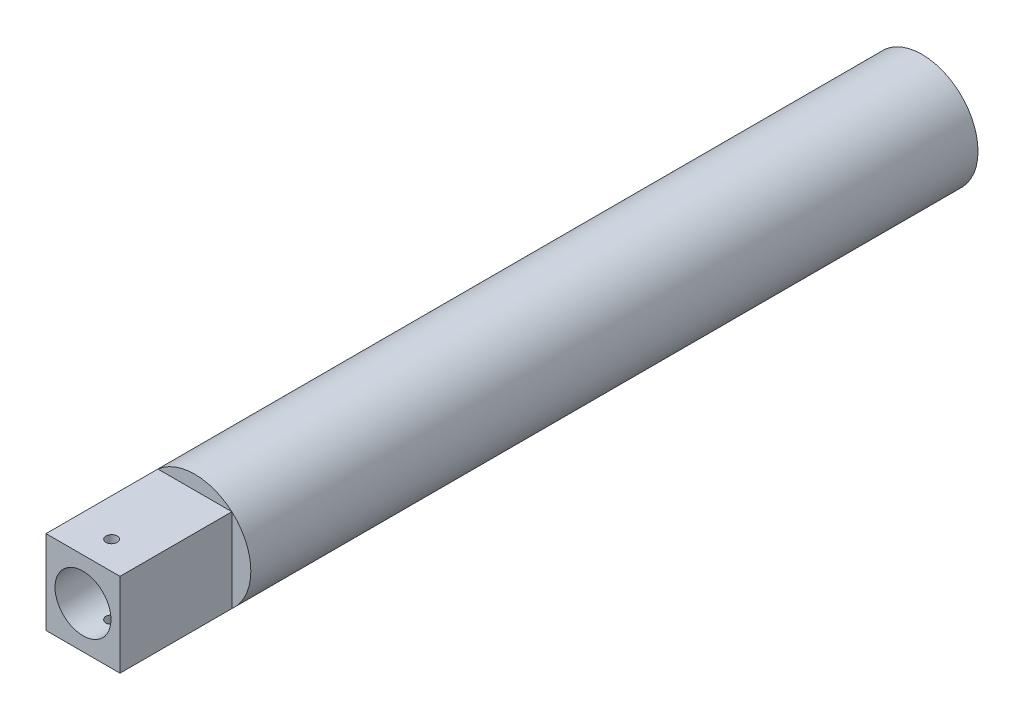
ISO-10303-21;
HEADER;
FILE_DESCRIPTION(('STEP AP214'),'2;1');
FILE_NAME('part.step','',(''),(''),'','','');
FILE_SCHEMA(('AUTOMOTIVE_DESIGN { 1 0 10303 214 1 1 1 1 }'));
ENDSEC;
DATA;
#1=APPLICATION_CONTEXT('core data for automotive mechanical design processes');
#2=APPLICATION_PROTOCOL_DEFINITION('international standard','automotive_design',2000,#1);
#3=PRODUCT_CONTEXT('',#1,'mechanical');
#4=PRODUCT('Part','Part','',(#3));
#5=PRODUCT_RELATED_PRODUCT_CATEGORY('part','',(#4));
#6=PRODUCT_DEFINITION_FORMATION('','',#4);
#7=PRODUCT_DEFINITION_CONTEXT('part definition',#1,'design');
#8=PRODUCT_DEFINITION('design','',#6,#7);
#9=PRODUCT_DEFINITION_SHAPE('','',#8);
#10=(LENGTH_UNIT() NAMED_UNIT(*) SI_UNIT(.MILLI.,.METRE.));
#11=(NAMED_UNIT(*) PLANE_ANGLE_UNIT() SI_UNIT($,.RADIAN.));
#12=(NAMED_UNIT(*) SI_UNIT($,.STERADIAN.) SOLID_ANGLE_UNIT());
#13=UNCERTAINTY_MEASURE_WITH_UNIT(LENGTH_MEASURE(1.E-05),#10,'distance_accuracy_value','');
#14=(GEOMETRIC_REPRESENTATION_CONTEXT(3) GLOBAL_UNCERTAINTY_ASSIGNED_CONTEXT((#13)) GLOBAL_UNIT_ASSIGNED_CONTEXT((#10,
#11,#12)) REPRESENTATION_CONTEXT('',''));
#15=CARTESIAN_POINT('',(0.,0.,0.));
#16=DIRECTION('',(0.,0.,1.));
#17=DIRECTION('',(1.,0.,0.));
#18=AXIS2_PLACEMENT_3D('',#15,#16,#17);
#19=CARTESIAN_POINT('',(0.114378277661477,-10.,145.));
#20=DIRECTION('',(0.,1.,0.));
#21=DIRECTION('',(0.,0.,1.));
#22=AXIS2_PLACEMENT_3D('',#19,#20,#21);
#23=CYLINDRICAL_SURFACE('',#22,1.);
#24=CARTESIAN_POINT('',(0.114378277661477,-4.99869158976619,146.));
#25=CARTESIAN_POINT('',(0.170120035537763,-4.99741506167197,145.999997895832));
#26=CARTESIAN_POINT('',(0.225867136771153,-4.99519802355829,145.995323412695));
#27=CARTESIAN_POINT('',(0.335741673011259,-4.98901929967575,145.976784440319));
#28=CARTESIAN_POINT('',(0.38986769761667,-4.98505613925301,145.962912178263));
#29=CARTESIAN_POINT('',(0.494897923069285,-4.97572645035253,145.926440121062));
#30=CARTESIAN_POINT('',(0.545805540123908,-4.97036144203048,145.903849767187));
#31=CARTESIAN_POINT('',(0.643089742596771,-4.95871343966632,145.850611296516));
#32=CARTESIAN_POINT('',(0.689466613576601,-4.95243050354126,145.819963687999));
#33=CARTESIAN_POINT('',(0.777089607106046,-4.93944562258576,145.750976338087));
#34=CARTESIAN_POINT('',(0.818256094637456,-4.93273909200816,145.712536283201));
#35=CARTESIAN_POINT('',(0.893592239114313,-4.91965022654363,145.629268015791));
#36=CARTESIAN_POINT('',(0.927761370045018,-4.91326791605652,145.584439323441));
#37=CARTESIAN_POINT('',(0.988364092906003,-4.90143856510257,145.489239552962));
#38=CARTESIAN_POINT('',(1.01473925255389,-4.89599870995302,145.438830320082));
#39=CARTESIAN_POINT('',(1.05860534738507,-4.88670245967501,145.334147652405));
#40=CARTESIAN_POINT('',(1.0760974626947,-4.88284585422241,145.279874731999));
#41=CARTESIAN_POINT('',(1.10139878851154,-4.87720076818045,145.170030388611));
#42=CARTESIAN_POINT('',(1.10937453546561,-4.87537675593952,145.114499176074));
#43=CARTESIAN_POINT('',(1.11593580594078,-4.8738793129392,145.002859161806));
#44=CARTESIAN_POINT('',(1.11452248272727,-4.87420561805494,144.946750431857));
#45=CARTESIAN_POINT('',(1.10246785144727,-4.87694579798378,144.836622151978));
#46=CARTESIAN_POINT('',(1.09199423835366,-4.87932173440697,144.782583168414));
#47=CARTESIAN_POINT('',(1.06238003976813,-4.88585473482707,144.677049932435));
#48=CARTESIAN_POINT('',(1.04323899282722,-4.89001189365457,144.62555581567));
#49=CARTESIAN_POINT('',(0.996673049075955,-4.89971531660359,144.526083404142));
#50=CARTESIAN_POINT('',(0.969181027382367,-4.9052727721345,144.478137666804));
#51=CARTESIAN_POINT('',(0.906748295938358,-4.91719581649291,144.387480619392));
#52=CARTESIAN_POINT('',(0.871806568474253,-4.9235615156875,144.344770025755));
#53=CARTESIAN_POINT('',(0.794542037788739,-4.9366252433629,144.264787383069));
#54=CARTESIAN_POINT('',(0.75207110128111,-4.94332752461851,144.227659004772));
#55=CARTESIAN_POINT('',(0.661451351880416,-4.95626611728922,144.16102793833));
#56=CARTESIAN_POINT('',(0.613302321356668,-4.96250241082891,144.131525542613));
#57=CARTESIAN_POINT('',(0.512371442416173,-4.97393853191512,144.080867231485));
#58=CARTESIAN_POINT('',(0.459567629002092,-4.97913301999783,144.059753795681));
#59=CARTESIAN_POINT('',(0.351028242511286,-4.98795955178011,144.026751231663));
#60=CARTESIAN_POINT('',(0.295293030462895,-4.99159178738191,144.01486097036));
#61=CARTESIAN_POINT('',(0.183499925002549,-4.99693954922506,144.000829890979));
#62=CARTESIAN_POINT('',(0.127464264955468,-4.99868712355804,143.998524090719));
#63=CARTESIAN_POINT('',(0.015770234793442,-5.00028701773098,144.003305251381));
#64=CARTESIAN_POINT('',(-0.0398881646351291,-5.00013948655194,144.010391473924));
#65=CARTESIAN_POINT('',(-0.148507017893883,-4.99808573969337,144.033596021351));
#66=CARTESIAN_POINT('',(-0.201492820801994,-4.99620196879863,144.049598047657));
#67=CARTESIAN_POINT('',(-0.304045995048695,-4.99101138160705,144.090076629202));
#68=CARTESIAN_POINT('',(-0.353613180239836,-4.98770448789048,144.114553645478));
#69=CARTESIAN_POINT('',(-0.448404990918725,-4.98008198030385,144.171531625564));
#70=CARTESIAN_POINT('',(-0.493587848987173,-4.97575779787315,144.204100888494));
#71=CARTESIAN_POINT('',(-0.577911134515753,-4.96667097632632,144.276249305179));
#72=CARTESIAN_POINT('',(-0.617050962267156,-4.96190829376833,144.315829153826));
#73=CARTESIAN_POINT('',(-0.688774748756434,-4.95246609881603,144.401572726019));
#74=CARTESIAN_POINT('',(-0.721252352198396,-4.94778888253687,144.447825750571));
#75=CARTESIAN_POINT('',(-0.777990126742658,-4.93918598301214,144.545188977642));
#76=CARTESIAN_POINT('',(-0.802250460262771,-4.93526028491315,144.596299084133));
#77=CARTESIAN_POINT('',(-0.841797793259557,-4.92866922267357,144.701844689803));
#78=CARTESIAN_POINT('',(-0.857102531995124,-4.92600136904368,144.756273377636));
#79=CARTESIAN_POINT('',(-0.878336186121026,-4.92226002392009,144.86698144596));
#80=CARTESIAN_POINT('',(-0.884266065339699,-4.92118636852773,144.923260635592));
#81=CARTESIAN_POINT('',(-0.886546324478016,-4.92077601157798,145.035210164376));
#82=CARTESIAN_POINT('',(-0.883032599858807,-4.92141466915198,145.090877688655));
#83=CARTESIAN_POINT('',(-0.86682528373247,-4.92429492408469,145.200815475684));
#84=CARTESIAN_POINT('',(-0.854131728784013,-4.92653651505972,145.255085743996));
#85=CARTESIAN_POINT('',(-0.819986088620032,-4.93233408682321,145.360600159378));
#86=CARTESIAN_POINT('',(-0.798551195447944,-4.9358874863174,145.411850021672));
#87=CARTESIAN_POINT('',(-0.747543871715365,-4.94386909199051,145.510051121745));
#88=CARTESIAN_POINT('',(-0.717970882550595,-4.94829735821498,145.557002064147));
#89=CARTESIAN_POINT('',(-0.651045096990274,-4.95754916646249,145.64596239723));
#90=CARTESIAN_POINT('',(-0.613591603889932,-4.96237727940446,145.687895576599));
#91=CARTESIAN_POINT('',(-0.532170930680058,-4.97176728431953,145.764928318971));
#92=CARTESIAN_POINT('',(-0.488202414182487,-4.97632912140482,145.800026476518));
#93=CARTESIAN_POINT('',(-0.394648798712733,-4.98462333309659,145.862600454121));
#94=CARTESIAN_POINT('',(-0.345028949181574,-4.98835010575967,145.890025085204));
#95=CARTESIAN_POINT('',(-0.241829078423585,-4.99441492583313,145.936110961399));
#96=CARTESIAN_POINT('',(-0.188252750935767,-4.99675425057551,145.954780263641));
#97=CARTESIAN_POINT('',(-0.0930463927034063,-4.99929853489828,145.979143034659));
#98=CARTESIAN_POINT('',(-0.0519552765109954,-4.99990161740638,145.986952875338));
#99=CARTESIAN_POINT('',(0.0308823307500083,-5.00007617911906,145.997382081365));
#100=CARTESIAN_POINT('',(0.0726288054707008,-4.99964768401582,146.00000157598));
#101=CARTESIAN_POINT('',(0.114378277661477,-4.99869158976619,146.));
#102=B_SPLINE_CURVE_WITH_KNOTS('',3,(#24,#25,#26,#27,#28,#29,#30,#31,#32,#33,#34,#35,#36,#37,
#38,#39,#40,#41,#42,#43,#44,#45,#46,#47,#48,#49,#50,#51,#52,#53,#54,#55,#56,#57,#58,#59,#60,#61,
#62,#63,#64,#65,#66,#67,#68,#69,#70,#71,#72,#73,#74,#75,#76,#77,#78,#79,#80,#81,#82,#83,#84,#85,
#86,#87,#88,#89,#90,#91,#92,#93,#94,#95,#96,#97,#98,#99,#100,#101),.UNSPECIFIED.,.T.,.F.,(4,2,2,
2,2,2,2,2,2,2,2,2,2,2,2,2,2,2,2,2,2,2,2,2,2,2,2,2,2,2,2,2,2,2,2,2,2,2,4),(0.,0.167115602610484,
0.33437261081792,0.501448993827079,0.668514839626893,0.837886159661586,1.00727020723591,
1.17789367860728,1.34849447644953,1.51606379668539,1.68361253465687,1.84812493117296,
2.01264608726031,2.17852631675926,2.34442922190201,2.514057756341,2.68369279443763,
2.85417619707057,3.02463865206955,3.19215438013514,3.35965693927154,3.52502407130943,
3.69040020067,3.85722257866074,4.02406150143365,4.19338596582118,4.3627070832438,
4.53169166369946,4.7006588697378,4.86720766800868,5.03375580300264,5.19997794684946,
5.36621150314106,5.534714444289,5.70325199741542,5.87288840069966,6.04236838751088,
6.16753778006465,6.29270405521722),.UNSPECIFIED.);
#103=CARTESIAN_POINT('',(0.114378277661477,-4.99869158976619,146.));
#104=VERTEX_POINT('',#103);
#105=EDGE_CURVE('E43',#104,#104,#102,.T.);
#106=ORIENTED_EDGE('',*,*,#105,.T.);
#107=EDGE_LOOP('',(#106));
#108=FACE_BOUND('',#107,.T.);
#109=CARTESIAN_POINT('',(0.114378277661477,-7.5,145.));
#110=DIRECTION('',(0.,-1.,0.));
#111=DIRECTION('',(0.,0.,-1.));
#112=AXIS2_PLACEMENT_3D('',#109,#110,#111);
#113=CIRCLE('',#112,1.);
#114=CARTESIAN_POINT('',(0.114378277661477,-7.5,144.));
#115=VERTEX_POINT('',#114);
#116=EDGE_CURVE('E180',#115,#115,#113,.T.);
#117=ORIENTED_EDGE('',*,*,#116,.T.);
#118=EDGE_LOOP('',(#117));
#119=FACE_BOUND('',#118,.T.);
#120=ADVANCED_FACE('F39',(#108,#119),#23,.F.);
#121=CARTESIAN_POINT('',(0.,0.,150.));
#122=DIRECTION('',(0.,0.,-1.));
#123=DIRECTION('',(-1.,0.,0.));
#124=AXIS2_PLACEMENT_3D('',#121,#122,#123);
#125=CYLINDRICAL_SURFACE('',#124,10.);
#126=CARTESIAN_POINT('',(0.,0.,0.));
#127=DIRECTION('',(0.,0.,1.));
#128=DIRECTION('',(1.,0.,0.));
#129=AXIS2_PLACEMENT_3D('',#126,#127,#128);
#130=CIRCLE('',#129,10.);
#131=CARTESIAN_POINT('',(10.,0.,0.));
#132=VERTEX_POINT('',#131);
#133=EDGE_CURVE('E11',#132,#132,#130,.T.);
#134=ORIENTED_EDGE('',*,*,#133,.T.);
#135=EDGE_LOOP('',(#134));
#136=FACE_BOUND('',#135,.T.);
#137=CARTESIAN_POINT('',(0.,0.,130.));
#138=DIRECTION('',(0.,0.,1.));
#139=DIRECTION('',(1.,0.,0.));
#140=AXIS2_PLACEMENT_3D('',#137,#138,#139);
#141=CIRCLE('',#140,10.);
#142=CARTESIAN_POINT('',(-6.61437827766148,7.5,130.));
#143=VERTEX_POINT('',#142);
#144=CARTESIAN_POINT('',(-6.61437827766148,-7.5,130.));
#145=VERTEX_POINT('',#144);
#146=EDGE_CURVE('E98',#143,#145,#141,.T.);
#147=ORIENTED_EDGE('',*,*,#146,.F.);
#148=CARTESIAN_POINT('',(0.,0.,130.));
#149=DIRECTION('',(0.,0.,1.));
#150=DIRECTION('',(1.,0.,0.));
#151=AXIS2_PLACEMENT_3D('',#148,#149,#150);
#152=CIRCLE('',#151,10.);
#153=CARTESIAN_POINT('',(6.61437827766148,7.5,130.));
#154=VERTEX_POINT('',#153);
#155=EDGE_CURVE('E106',#154,#143,#152,.T.);
#156=ORIENTED_EDGE('',*,*,#155,.F.);
#157=CARTESIAN_POINT('',(0.,0.,130.));
#158=DIRECTION('',(0.,0.,1.));
#159=DIRECTION('',(1.,0.,0.));
#160=AXIS2_PLACEMENT_3D('',#157,#158,#159);
#161=CIRCLE('',#160,10.);
#162=CARTESIAN_POINT('',(6.61437827766148,-7.5,130.));
#163=VERTEX_POINT('',#162);
#164=EDGE_CURVE('E190',#163,#154,#161,.T.);
#165=ORIENTED_EDGE('',*,*,#164,.F.);
#166=CARTESIAN_POINT('',(0.,0.,130.));
#167=DIRECTION('',(0.,0.,1.));
#168=DIRECTION('',(1.,0.,0.));
#169=AXIS2_PLACEMENT_3D('',#166,#167,#168);
#170=CIRCLE('',#169,10.);
#171=EDGE_CURVE('E108',#145,#163,#170,.T.);
#172=ORIENTED_EDGE('',*,*,#171,.F.);
#173=EDGE_LOOP('',(#147,#156,#165,#172));
#174=FACE_BOUND('',#173,.T.);
#175=ADVANCED_FACE('F41',(#136,#174),#125,.T.);
#176=CARTESIAN_POINT('',(0.,0.,150.));
#177=DIRECTION('',(0.,0.,1.));
#178=DIRECTION('',(1.,0.,0.));
#179=AXIS2_PLACEMENT_3D('',#176,#177,#178);
#180=PLANE('',#179);
#181=CARTESIAN_POINT('',(0.,0.,150.));
#182=DIRECTION('',(0.,0.,-1.));
#183=DIRECTION('',(-1.,0.,0.));
#184=AXIS2_PLACEMENT_3D('',#181,#182,#183);
#185=CIRCLE('',#184,5.);
#186=CARTESIAN_POINT('',(-5.,0.,150.));
#187=VERTEX_POINT('',#186);
#188=EDGE_CURVE('E137',#187,#187,#185,.T.);
#189=ORIENTED_EDGE('',*,*,#188,.T.);
#190=EDGE_LOOP('',(#189));
#191=FACE_BOUND('',#190,.T.);
#192=DIRECTION('',(1.,0.,0.));
#193=VECTOR('',#192,1.);
#194=CARTESIAN_POINT('',(0.,7.5,150.));
#195=LINE('',#194,#193);
#196=CARTESIAN_POINT('',(-6.61437827766148,7.5,150.));
#197=VERTEX_POINT('',#196);
#198=CARTESIAN_POINT('',(6.61437827766148,7.5,150.));
#199=VERTEX_POINT('',#198);
#200=EDGE_CURVE('E114',#197,#199,#195,.T.);
#201=ORIENTED_EDGE('',*,*,#200,.F.);
#202=DIRECTION('',(0.,-1.,0.));
#203=VECTOR('',#202,1.);
#204=CARTESIAN_POINT('',(-6.61437827766148,0.,150.));
#205=LINE('',#204,#203);
#206=CARTESIAN_POINT('',(-6.61437827766148,-7.5,150.));
#207=VERTEX_POINT('',#206);
#208=EDGE_CURVE('E61',#197,#207,#205,.T.);
#209=ORIENTED_EDGE('',*,*,#208,.T.);
#210=DIRECTION('',(1.,0.,0.));
#211=VECTOR('',#210,1.);
#212=CARTESIAN_POINT('',(0.,-7.5,150.));
#213=LINE('',#212,#211);
#214=CARTESIAN_POINT('',(6.61437827766148,-7.5,150.));
#215=VERTEX_POINT('',#214);
#216=EDGE_CURVE('E127',#207,#215,#213,.T.);
#217=ORIENTED_EDGE('',*,*,#216,.T.);
#218=DIRECTION('',(0.,-1.,0.));
#219=VECTOR('',#218,1.);
#220=CARTESIAN_POINT('',(6.61437827766148,0.,150.));
#221=LINE('',#220,#219);
#222=EDGE_CURVE('E109',#199,#215,#221,.T.);
#223=ORIENTED_EDGE('',*,*,#222,.F.);
#224=EDGE_LOOP('',(#201,#209,#217,#223));
#225=FACE_BOUND('',#224,.T.);
#226=ADVANCED_FACE('F173',(#191,#225),#180,.T.);
#227=CARTESIAN_POINT('',(0.,0.,0.));
#228=DIRECTION('',(0.,0.,1.));
#229=DIRECTION('',(1.,0.,0.));
#230=AXIS2_PLACEMENT_3D('',#227,#228,#229);
#231=PLANE('',#230);
#232=CARTESIAN_POINT('',(0.,0.,0.));
#233=DIRECTION('',(0.,0.,-1.));
#234=DIRECTION('',(-1.,0.,0.));
#235=AXIS2_PLACEMENT_3D('',#232,#233,#234);
#236=CIRCLE('',#235,5.);
#237=CARTESIAN_POINT('',(-5.,0.,0.));
#238=VERTEX_POINT('',#237);
#239=EDGE_CURVE('E232',#238,#238,#236,.T.);
#240=ORIENTED_EDGE('',*,*,#239,.F.);
#241=EDGE_LOOP('',(#240));
#242=FACE_BOUND('',#241,.T.);
#243=CARTESIAN_POINT('',(-7.5,0.,0.));
#244=DIRECTION('',(0.,0.,-1.));
#245=DIRECTION('',(-1.,0.,0.));
#246=AXIS2_PLACEMENT_3D('',#243,#244,#245);
#247=CIRCLE('',#246,1.);
#248=CARTESIAN_POINT('',(-8.5,0.,0.));
#249=VERTEX_POINT('',#248);
#250=EDGE_CURVE('E236',#249,#249,#247,.T.);
#251=ORIENTED_EDGE('',*,*,#250,.F.);
#252=EDGE_LOOP('',(#251));
#253=FACE_BOUND('',#252,.T.);
#254=CARTESIAN_POINT('',(7.5,0.,0.));
#255=DIRECTION('',(0.,0.,-1.));
#256=DIRECTION('',(-1.,0.,0.));
#257=AXIS2_PLACEMENT_3D('',#254,#255,#256);
#258=CIRCLE('',#257,0.999999999999999);
#259=CARTESIAN_POINT('',(6.5,0.,0.));
#260=VERTEX_POINT('',#259);
#261=EDGE_CURVE('E240',#260,#260,#258,.T.);
#262=ORIENTED_EDGE('',*,*,#261,.F.);
#263=EDGE_LOOP('',(#262));
#264=FACE_BOUND('',#263,.T.);
#265=ORIENTED_EDGE('',*,*,#133,.F.);
#266=EDGE_LOOP('',(#265));
#267=FACE_BOUND('',#266,.T.);
#268=ADVANCED_FACE('F222',(#242,#253,#264,#267),#231,.F.);
#269=CARTESIAN_POINT('',(0.,-7.5,130.));
#270=DIRECTION('',(0.,-1.,0.));
#271=DIRECTION('',(0.,0.,-1.));
#272=AXIS2_PLACEMENT_3D('',#269,#270,#271);
#273=PLANE('',#272);
#274=ORIENTED_EDGE('',*,*,#116,.F.);
#275=EDGE_LOOP('',(#274));
#276=FACE_BOUND('',#275,.T.);
#277=ORIENTED_EDGE('',*,*,#216,.F.);
#278=DIRECTION('',(0.,0.,1.));
#279=VECTOR('',#278,1.);
#280=CARTESIAN_POINT('',(-6.61437827766148,-7.5,130.));
#281=LINE('',#280,#279);
#282=EDGE_CURVE('E122',#145,#207,#281,.T.);
#283=ORIENTED_EDGE('',*,*,#282,.F.);
#284=DIRECTION('',(1.,0.,0.));
#285=VECTOR('',#284,1.);
#286=CARTESIAN_POINT('',(0.,-7.5,130.));
#287=LINE('',#286,#285);
#288=EDGE_CURVE('E124',#145,#163,#287,.T.);
#289=ORIENTED_EDGE('',*,*,#288,.T.);
#290=DIRECTION('',(0.,0.,1.));
#291=VECTOR('',#290,1.);
#292=CARTESIAN_POINT('',(6.61437827766148,-7.5,130.));
#293=LINE('',#292,#291);
#294=EDGE_CURVE('E131',#163,#215,#293,.T.);
#295=ORIENTED_EDGE('',*,*,#294,.T.);
#296=EDGE_LOOP('',(#277,#283,#289,#295));
#297=FACE_BOUND('',#296,.T.);
#298=ADVANCED_FACE('F196',(#276,#297),#273,.T.);
#299=CARTESIAN_POINT('',(0.,0.,130.));
#300=DIRECTION('',(0.,0.,1.));
#301=DIRECTION('',(1.,0.,0.));
#302=AXIS2_PLACEMENT_3D('',#299,#300,#301);
#303=PLANE('',#302);
#304=ORIENTED_EDGE('',*,*,#288,.F.);
#305=ORIENTED_EDGE('',*,*,#171,.T.);
#306=EDGE_LOOP('',(#304,#305));
#307=FACE_BOUND('',#306,.T.);
#308=ADVANCED_FACE('F215',(#307),#303,.T.);
#309=CARTESIAN_POINT('',(0.,7.5,130.));
#310=DIRECTION('',(0.,-1.,0.));
#311=DIRECTION('',(0.,0.,-1.));
#312=AXIS2_PLACEMENT_3D('',#309,#310,#311);
#313=PLANE('',#312);
#314=CARTESIAN_POINT('',(0.114378277661477,7.5,145.));
#315=DIRECTION('',(0.,1.,0.));
#316=DIRECTION('',(0.,0.,1.));
#317=AXIS2_PLACEMENT_3D('',#314,#315,#316);
#318=CIRCLE('',#317,1.);
#319=CARTESIAN_POINT('',(0.114378277661477,7.5,146.));
#320=VERTEX_POINT('',#319);
#321=EDGE_CURVE('E182',#320,#320,#318,.T.);
#322=ORIENTED_EDGE('',*,*,#321,.F.);
#323=EDGE_LOOP('',(#322));
#324=FACE_BOUND('',#323,.T.);
#325=ORIENTED_EDGE('',*,*,#200,.T.);
#326=DIRECTION('',(0.,0.,1.));
#327=VECTOR('',#326,1.);
#328=CARTESIAN_POINT('',(6.61437827766148,7.5,130.));
#329=LINE('',#328,#327);
#330=EDGE_CURVE('E53',#154,#199,#329,.T.);
#331=ORIENTED_EDGE('',*,*,#330,.F.);
#332=DIRECTION('',(1.,0.,0.));
#333=VECTOR('',#332,1.);
#334=CARTESIAN_POINT('',(0.,7.5,130.));
#335=LINE('',#334,#333);
#336=EDGE_CURVE('E93',#143,#154,#335,.T.);
#337=ORIENTED_EDGE('',*,*,#336,.F.);
#338=DIRECTION('',(0.,0.,1.));
#339=VECTOR('',#338,1.);
#340=CARTESIAN_POINT('',(-6.61437827766148,7.5,130.));
#341=LINE('',#340,#339);
#342=EDGE_CURVE('E84',#143,#197,#341,.T.);
#343=ORIENTED_EDGE('',*,*,#342,.T.);
#344=EDGE_LOOP('',(#325,#331,#337,#343));
#345=FACE_BOUND('',#344,.T.);
#346=ADVANCED_FACE('F117',(#324,#345),#313,.F.);
#347=CARTESIAN_POINT('',(0.,0.,130.));
#348=DIRECTION('',(0.,0.,1.));
#349=DIRECTION('',(1.,0.,0.));
#350=AXIS2_PLACEMENT_3D('',#347,#348,#349);
#351=PLANE('',#350);
#352=ORIENTED_EDGE('',*,*,#155,.T.);
#353=ORIENTED_EDGE('',*,*,#336,.T.);
#354=EDGE_LOOP('',(#352,#353));
#355=FACE_BOUND('',#354,.T.);
#356=ADVANCED_FACE('F113',(#355),#351,.T.);
#357=CARTESIAN_POINT('',(6.61437827766148,0.,130.));
#358=DIRECTION('',(-1.,0.,0.));
#359=DIRECTION('',(0.,0.,1.));
#360=AXIS2_PLACEMENT_3D('',#357,#358,#359);
#361=PLANE('',#360);
#362=ORIENTED_EDGE('',*,*,#222,.T.);
#363=ORIENTED_EDGE('',*,*,#294,.F.);
#364=DIRECTION('',(0.,-1.,0.));
#365=VECTOR('',#364,1.);
#366=CARTESIAN_POINT('',(6.61437827766148,0.,130.));
#367=LINE('',#366,#365);
#368=EDGE_CURVE('E69',#154,#163,#367,.T.);
#369=ORIENTED_EDGE('',*,*,#368,.F.);
#370=ORIENTED_EDGE('',*,*,#330,.T.);
#371=EDGE_LOOP('',(#362,#363,#369,#370));
#372=FACE_BOUND('',#371,.T.);
#373=ADVANCED_FACE('F200',(#372),#361,.F.);
#374=CARTESIAN_POINT('',(0.,0.,130.));
#375=DIRECTION('',(0.,0.,1.));
#376=DIRECTION('',(1.,0.,0.));
#377=AXIS2_PLACEMENT_3D('',#374,#375,#376);
#378=PLANE('',#377);
#379=ORIENTED_EDGE('',*,*,#164,.T.);
#380=ORIENTED_EDGE('',*,*,#368,.T.);
#381=EDGE_LOOP('',(#379,#380));
#382=FACE_BOUND('',#381,.T.);
#383=ADVANCED_FACE('F202',(#382),#378,.T.);
#384=CARTESIAN_POINT('',(-6.61437827766148,0.,130.));
#385=DIRECTION('',(-1.,0.,0.));
#386=DIRECTION('',(0.,0.,1.));
#387=AXIS2_PLACEMENT_3D('',#384,#385,#386);
#388=PLANE('',#387);
#389=ORIENTED_EDGE('',*,*,#208,.F.);
#390=ORIENTED_EDGE('',*,*,#342,.F.);
#391=DIRECTION('',(0.,-1.,0.));
#392=VECTOR('',#391,1.);
#393=CARTESIAN_POINT('',(-6.61437827766148,0.,130.));
#394=LINE('',#393,#392);
#395=EDGE_CURVE('E87',#143,#145,#394,.T.);
#396=ORIENTED_EDGE('',*,*,#395,.T.);
#397=ORIENTED_EDGE('',*,*,#282,.T.);
#398=EDGE_LOOP('',(#389,#390,#396,#397));
#399=FACE_BOUND('',#398,.T.);
#400=ADVANCED_FACE('F86',(#399),#388,.T.);
#401=CARTESIAN_POINT('',(0.,0.,130.));
#402=DIRECTION('',(0.,0.,1.));
#403=DIRECTION('',(1.,0.,0.));
#404=AXIS2_PLACEMENT_3D('',#401,#402,#403);
#405=PLANE('',#404);
#406=ORIENTED_EDGE('',*,*,#395,.F.);
#407=ORIENTED_EDGE('',*,*,#146,.T.);
#408=EDGE_LOOP('',(#406,#407));
#409=FACE_BOUND('',#408,.T.);
#410=ADVANCED_FACE('F97',(#409),#405,.T.);
#411=CARTESIAN_POINT('',(0.114378277661477,4.99869158976619,146.));
#412=CARTESIAN_POINT('',(0.0589455535402362,4.99995899719268,145.999998018791));
#413=CARTESIAN_POINT('',(0.00346671452975621,5.00029747071234,145.995375409575));
#414=CARTESIAN_POINT('',(-0.10596663932715,4.99917720426389,145.97700111374));
#415=CARTESIAN_POINT('',(-0.159919990230163,4.99771712794744,145.963242642547));
#416=CARTESIAN_POINT('',(-0.264702471159116,4.99326359294363,145.927020795048));
#417=CARTESIAN_POINT('',(-0.315534140524615,4.99027139957164,145.904564605567));
#418=CARTESIAN_POINT('',(-0.412720388859032,4.98317561438655,145.851604459092));
#419=CARTESIAN_POINT('',(-0.459075220395413,4.97907208532085,145.821100956461));
#420=CARTESIAN_POINT('',(-0.546529505316926,4.97023740826503,145.752542125636));
#421=CARTESIAN_POINT('',(-0.587569857032277,4.96550022646625,145.714412190127));
#422=CARTESIAN_POINT('',(-0.662725400814443,4.95602998668845,145.631844001695));
#423=CARTESIAN_POINT('',(-0.696840044963272,4.95129692906518,145.58740525013));
#424=CARTESIAN_POINT('',(-0.757519932291544,4.94237969931402,145.492927597955));
#425=CARTESIAN_POINT('',(-0.784003161406932,4.9382017326674,145.442835369636));
#426=CARTESIAN_POINT('',(-0.828163073204017,4.93098871214696,145.338831619295));
#427=CARTESIAN_POINT('',(-0.845840370354625,4.92795357853101,145.284920364062));
#428=CARTESIAN_POINT('',(-0.871727751845787,4.92344021765262,145.175319258907));
#429=CARTESIAN_POINT('',(-0.880021545199988,4.92194823459432,145.119649763911));
#430=CARTESIAN_POINT('',(-0.887163868501864,4.92066603821362,145.007690945873));
#431=CARTESIAN_POINT('',(-0.886013182975379,4.92087568354179,144.951401674703));
#432=CARTESIAN_POINT('',(-0.874377910781966,4.92295605206784,144.840530810876));
#433=CARTESIAN_POINT('',(-0.864008000051337,4.92480636659692,144.785936740364));
#434=CARTESIAN_POINT('',(-0.83440992301961,4.92990705205952,144.679274955855));
#435=CARTESIAN_POINT('',(-0.815181376801951,4.93315748303886,144.627207350315));
#436=CARTESIAN_POINT('',(-0.768300778923704,4.94067582765739,144.526748355452));
#437=CARTESIAN_POINT('',(-0.740603364313658,4.94494919313739,144.47837856147));
#438=CARTESIAN_POINT('',(-0.677597825181233,4.95397526294885,144.386927564883));
#439=CARTESIAN_POINT('',(-0.642288984458628,4.95872801236572,144.343846860557));
#440=CARTESIAN_POINT('',(-0.564470746809924,4.96819150715116,144.263567924334));
#441=CARTESIAN_POINT('',(-0.521867699974571,4.97290073960527,144.226460220146));
#442=CARTESIAN_POINT('',(-0.430979492679582,4.98159986206284,144.159906431546));
#443=CARTESIAN_POINT('',(-0.38269438829431,4.98558975916419,144.130460271536));
#444=CARTESIAN_POINT('',(-0.281851179878363,4.99230476830186,144.080123252821));
#445=CARTESIAN_POINT('',(-0.229299051157554,4.99503161433479,144.059220669618));
#446=CARTESIAN_POINT('',(-0.121371860161755,4.99881798996037,144.026552642894));
#447=CARTESIAN_POINT('',(-0.0659971282948133,4.99987771424221,144.014786132529));
#448=CARTESIAN_POINT('',(0.0450604673568815,5.00010040767435,144.000861559746));
#449=CARTESIAN_POINT('',(0.100724648474455,4.99929307234484,143.998554664178));
#450=CARTESIAN_POINT('',(0.211605474412114,4.99582823228919,144.003192234031));
#451=CARTESIAN_POINT('',(0.266822134273798,4.99317079000991,144.010136387208));
#452=CARTESIAN_POINT('',(0.374961016234547,4.98621368216385,144.032976005677));
#453=CARTESIAN_POINT('',(0.427893567650859,4.98192252271853,144.048825305406));
#454=CARTESIAN_POINT('',(0.530333237153398,4.97206167415043,144.088952056113));
#455=CARTESIAN_POINT('',(0.579840029028897,4.96649186348822,144.113230308399));
#456=CARTESIAN_POINT('',(0.67486975134558,4.95448107235182,144.169964311305));
#457=CARTESIAN_POINT('',(0.720318496004748,4.94802785841332,144.202541708545));
#458=CARTESIAN_POINT('',(0.805153690740169,4.93493397541906,144.274786767004));
#459=CARTESIAN_POINT('',(0.844539445778906,4.92829328497484,144.314455239993));
#460=CARTESIAN_POINT('',(0.916742153352695,4.91537917667418,144.400489239692));
#461=CARTESIAN_POINT('',(0.949450148161172,4.90911287652352,144.446947405272));
#462=CARTESIAN_POINT('',(1.00658531622006,4.89771766470761,144.544832593732));
#463=CARTESIAN_POINT('',(1.03101302240172,4.89258867985048,144.596259296556));
#464=CARTESIAN_POINT('',(1.0706500186145,4.88406782658184,144.702155664165));
#465=CARTESIAN_POINT('',(1.08594085307118,4.88066063515111,144.756593524525));
#466=CARTESIAN_POINT('',(1.10714308239373,4.87589525627689,144.867350703022));
#467=CARTESIAN_POINT('',(1.11305599131116,4.87453673808001,144.923669715949));
#468=CARTESIAN_POINT('',(1.11527882136405,4.87402848945876,145.03524063218));
#469=CARTESIAN_POINT('',(1.11180074843661,4.87482999469019,145.090488201011));
#470=CARTESIAN_POINT('',(1.09580783513784,4.87844967678672,145.199588772031));
#471=CARTESIAN_POINT('',(1.08329310343923,4.88126782940008,145.253441790982));
#472=CARTESIAN_POINT('',(1.04967572439617,4.88860647878564,145.358093688776));
#473=CARTESIAN_POINT('',(1.02859813017385,4.89312200654198,145.408900985308));
#474=CARTESIAN_POINT('',(0.978481336337192,4.90338921011121,145.50628622161));
#475=CARTESIAN_POINT('',(0.949441344997896,4.90914100883791,145.552863740186));
#476=CARTESIAN_POINT('',(0.883523120020661,4.92143586194935,145.641505656551));
#477=CARTESIAN_POINT('',(0.846495339264662,4.92799280896497,145.683456928118));
#478=CARTESIAN_POINT('',(0.765968965727067,4.94114894011695,145.760618161247));
#479=CARTESIAN_POINT('',(0.722468718901295,4.94774813463595,145.795826394345));
#480=CARTESIAN_POINT('',(0.629461121234996,4.96044474414892,145.859009693137));
#481=CARTESIAN_POINT('',(0.579873747839982,4.96653319169638,145.88686886164));
#482=CARTESIAN_POINT('',(0.476612883672132,4.97750200616735,145.933807641449));
#483=CARTESIAN_POINT('',(0.422943029360563,4.98238343214032,145.952894961955));
#484=CARTESIAN_POINT('',(0.32671401369106,4.98948685512444,145.978130511403));
#485=CARTESIAN_POINT('',(0.284703417703695,4.99206821078536,145.986314382629));
#486=CARTESIAN_POINT('',(0.199930446546336,4.99618138650026,145.997249783913));
#487=CARTESIAN_POINT('',(0.157168101249414,4.99771324816286,146.000001529341));
#488=CARTESIAN_POINT('',(0.114378277661477,4.99869158976619,146.));
#489=B_SPLINE_CURVE_WITH_KNOTS('',3,(#411,#412,#413,#414,#415,#416,#417,#418,#419,#420,#421,
#422,#423,#424,#425,#426,#427,#428,#429,#430,#431,#432,#433,#434,#435,#436,#437,#438,#439,#440,
#441,#442,#443,#444,#445,#446,#447,#448,#449,#450,#451,#452,#453,#454,#455,#456,#457,#458,#459,
#460,#461,#462,#463,#464,#465,#466,#467,#468,#469,#470,#471,#472,#473,#474,#475,#476,#477,#478,
#479,#480,#481,#482,#483,#484,#485,#486,#487,#488),.UNSPECIFIED.,.T.,.F.,(4,2,2,2,2,2,2,2,2,2,2,
2,2,2,2,2,2,2,2,2,2,2,2,2,2,2,2,2,2,2,2,2,2,2,2,2,2,2,4),(0.,0.166185868668797,
0.332495290338458,0.498667584577948,0.664830498477248,0.832706321500053,1.00059542062026,
1.17022671290607,1.33984616683549,1.50794023295189,1.67602033611644,1.84203853213407,
2.00806384876692,2.17499452851894,2.3419409225426,2.51121818877387,2.68049378460335,
2.84953629429321,3.01855906145874,3.1849120545966,3.35125943307554,3.51675229565194,
3.68226089531316,3.85035111689891,4.01846059336638,4.18912559890663,4.35977961811588,
4.52888691512088,4.69796690723437,4.86326193608991,5.02855497717944,5.19336784933176,
5.35819711526769,5.52643186145877,5.69470967425727,5.86550105112053,6.03614203836809,
6.16442990570922,6.29271268660941),.UNSPECIFIED.);
#490=CARTESIAN_POINT('',(0.114378277661477,4.99869158976619,146.));
#491=VERTEX_POINT('',#490);
#492=EDGE_CURVE('E132',#491,#491,#489,.T.);
#493=ORIENTED_EDGE('',*,*,#492,.T.);
#494=EDGE_LOOP('',(#493));
#495=FACE_BOUND('',#494,.T.);
#496=ORIENTED_EDGE('',*,*,#321,.T.);
#497=EDGE_LOOP('',(#496));
#498=FACE_BOUND('',#497,.T.);
#499=ADVANCED_FACE('F138',(#495,#498),#23,.F.);
#500=CARTESIAN_POINT('',(7.5,0.,10.));
#501=DIRECTION('',(0.,0.,-1.));
#502=DIRECTION('',(-1.,0.,0.));
#503=AXIS2_PLACEMENT_3D('',#500,#501,#502);
#504=CYLINDRICAL_SURFACE('',#503,0.999999999999999);
#505=CARTESIAN_POINT('',(7.5,0.,10.));
#506=DIRECTION('',(0.,0.,-1.));
#507=DIRECTION('',(-1.,0.,0.));
#508=AXIS2_PLACEMENT_3D('',#505,#506,#507);
#509=CIRCLE('',#508,0.999999999999999);
#510=CARTESIAN_POINT('',(6.5,0.,10.));
#511=VERTEX_POINT('',#510);
#512=EDGE_CURVE('E242',#511,#511,#509,.T.);
#513=ORIENTED_EDGE('',*,*,#512,.F.);
#514=EDGE_LOOP('',(#513));
#515=FACE_BOUND('',#514,.T.);
#516=ORIENTED_EDGE('',*,*,#261,.T.);
#517=EDGE_LOOP('',(#516));
#518=FACE_BOUND('',#517,.T.);
#519=ADVANCED_FACE('F158',(#515,#518),#504,.F.);
#520=CARTESIAN_POINT('',(7.5,0.,10.));
#521=DIRECTION('',(0.,0.,-1.));
#522=DIRECTION('',(-1.,0.,0.));
#523=AXIS2_PLACEMENT_3D('',#520,#521,#522);
#524=PLANE('',#523);
#525=ORIENTED_EDGE('',*,*,#512,.T.);
#526=EDGE_LOOP('',(#525));
#527=FACE_BOUND('',#526,.T.);
#528=ADVANCED_FACE('F155',(#527),#524,.T.);
#529=CARTESIAN_POINT('',(-7.5,0.,10.));
#530=DIRECTION('',(0.,0.,-1.));
#531=DIRECTION('',(-1.,0.,0.));
#532=AXIS2_PLACEMENT_3D('',#529,#530,#531);
#533=CYLINDRICAL_SURFACE('',#532,1.);
#534=CARTESIAN_POINT('',(-7.5,0.,10.));
#535=DIRECTION('',(0.,0.,-1.));
#536=DIRECTION('',(-1.,0.,0.));
#537=AXIS2_PLACEMENT_3D('',#534,#535,#536);
#538=CIRCLE('',#537,1.);
#539=CARTESIAN_POINT('',(-8.5,0.,10.));
#540=VERTEX_POINT('',#539);
#541=EDGE_CURVE('E186',#540,#540,#538,.T.);
#542=ORIENTED_EDGE('',*,*,#541,.F.);
#543=EDGE_LOOP('',(#542));
#544=FACE_BOUND('',#543,.T.);
#545=ORIENTED_EDGE('',*,*,#250,.T.);
#546=EDGE_LOOP('',(#545));
#547=FACE_BOUND('',#546,.T.);
#548=ADVANCED_FACE('F151',(#544,#547),#533,.F.);
#549=CARTESIAN_POINT('',(-7.5,0.,10.));
#550=DIRECTION('',(0.,0.,-1.));
#551=DIRECTION('',(-1.,0.,0.));
#552=AXIS2_PLACEMENT_3D('',#549,#550,#551);
#553=PLANE('',#552);
#554=ORIENTED_EDGE('',*,*,#541,.T.);
#555=EDGE_LOOP('',(#554));
#556=FACE_BOUND('',#555,.T.);
#557=ADVANCED_FACE('F146',(#556),#553,.T.);
#558=CARTESIAN_POINT('',(0.,0.,150.));
#559=DIRECTION('',(0.,0.,-1.));
#560=DIRECTION('',(-1.,0.,0.));
#561=AXIS2_PLACEMENT_3D('',#558,#559,#560);
#562=CYLINDRICAL_SURFACE('',#561,5.);
#563=ORIENTED_EDGE('',*,*,#492,.F.);
#564=EDGE_LOOP('',(#563));
#565=FACE_BOUND('',#564,.T.);
#566=ORIENTED_EDGE('',*,*,#188,.F.);
#567=EDGE_LOOP('',(#566));
#568=FACE_BOUND('',#567,.T.);
#569=ORIENTED_EDGE('',*,*,#239,.T.);
#570=EDGE_LOOP('',(#569));
#571=FACE_BOUND('',#570,.T.);
#572=ORIENTED_EDGE('',*,*,#105,.F.);
#573=EDGE_LOOP('',(#572));
#574=FACE_BOUND('',#573,.T.);
#575=ADVANCED_FACE('F142',(#565,#568,#571,#574),#562,.F.);
#576=CLOSED_SHELL('',(#120,#175,#226,#268,#298,#308,#346,#356,#373,#383,#400,#410,#499,#519,
#528,#548,#557,#575));
#577=MANIFOLD_SOLID_BREP('B2',#576);
#578=ADVANCED_BREP_SHAPE_REPRESENTATION('',(#18,#577),#14);
#579=SHAPE_DEFINITION_REPRESENTATION(#9,#578);
ENDSEC;
END-ISO-10303-21;
